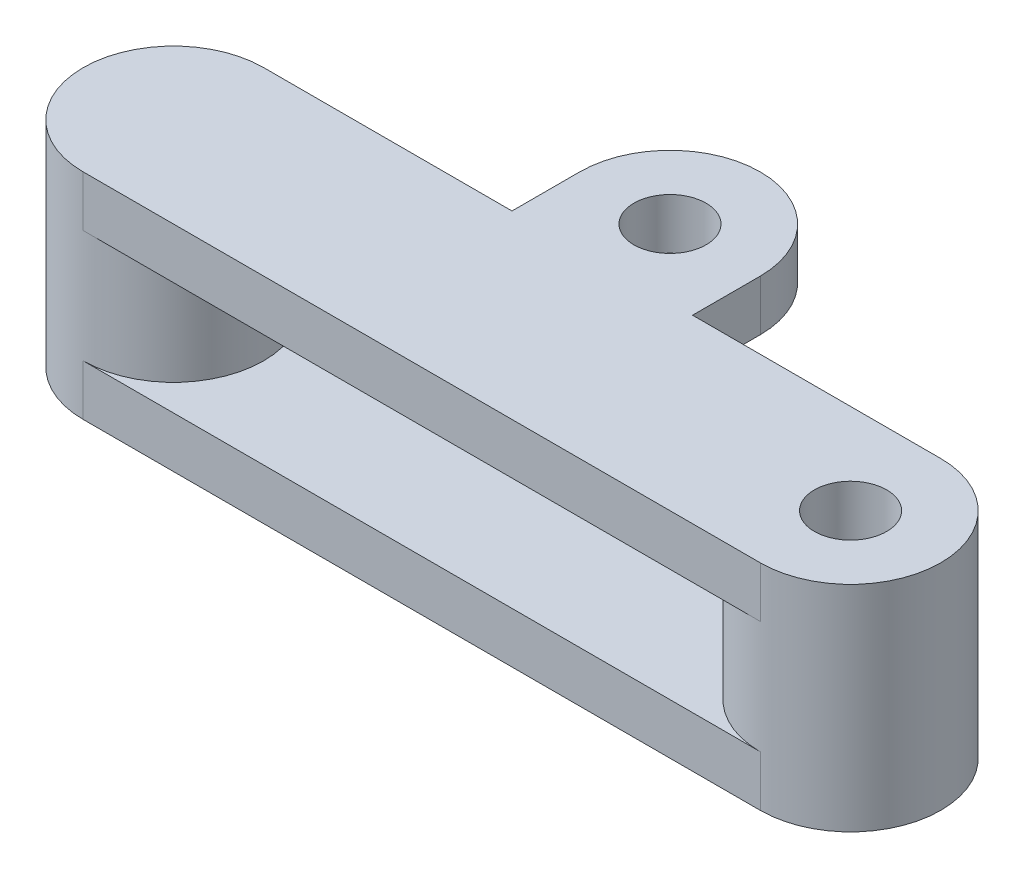
ISO-10303-21;
HEADER;
FILE_DESCRIPTION(('STEP AP214'),'2;1');
FILE_NAME('part.step','',(''),(''),'','','');
FILE_SCHEMA(('AUTOMOTIVE_DESIGN { 1 0 10303 214 1 1 1 1 }'));
ENDSEC;
DATA;
#1=APPLICATION_CONTEXT('core data for automotive mechanical design processes');
#2=APPLICATION_PROTOCOL_DEFINITION('international standard','automotive_design',2000,#1);
#3=PRODUCT_CONTEXT('',#1,'mechanical');
#4=PRODUCT('Part','Part','',(#3));
#5=PRODUCT_RELATED_PRODUCT_CATEGORY('part','',(#4));
#6=PRODUCT_DEFINITION_FORMATION('','',#4);
#7=PRODUCT_DEFINITION_CONTEXT('part definition',#1,'design');
#8=PRODUCT_DEFINITION('design','',#6,#7);
#9=PRODUCT_DEFINITION_SHAPE('','',#8);
#10=(LENGTH_UNIT() NAMED_UNIT(*) SI_UNIT(.MILLI.,.METRE.));
#11=(NAMED_UNIT(*) PLANE_ANGLE_UNIT() SI_UNIT($,.RADIAN.));
#12=(NAMED_UNIT(*) SI_UNIT($,.STERADIAN.) SOLID_ANGLE_UNIT());
#13=UNCERTAINTY_MEASURE_WITH_UNIT(LENGTH_MEASURE(1.E-05),#10,'distance_accuracy_value','');
#14=(GEOMETRIC_REPRESENTATION_CONTEXT(3) GLOBAL_UNCERTAINTY_ASSIGNED_CONTEXT((#13)) GLOBAL_UNIT_ASSIGNED_CONTEXT((#10,
#11,#12)) REPRESENTATION_CONTEXT('',''));
#15=CARTESIAN_POINT('',(0.,0.,0.));
#16=DIRECTION('',(0.,0.,1.));
#17=DIRECTION('',(1.,0.,0.));
#18=AXIS2_PLACEMENT_3D('',#15,#16,#17);
#19=CARTESIAN_POINT('',(0.,9.5,-4.));
#20=DIRECTION('',(0.,0.,1.));
#21=DIRECTION('',(1.,0.,0.));
#22=AXIS2_PLACEMENT_3D('',#19,#20,#21);
#23=PLANE('',#22);
#24=DIRECTION('',(-1.,0.,0.));
#25=VECTOR('',#24,1.);
#26=CARTESIAN_POINT('',(0.,2.25,-4.));
#27=LINE('',#26,#25);
#28=CARTESIAN_POINT('',(0.,2.25,-4.));
#29=VERTEX_POINT('',#28);
#30=CARTESIAN_POINT('',(-11.,2.25,-4.));
#31=VERTEX_POINT('',#30);
#32=EDGE_CURVE('E155',#29,#31,#27,.T.);
#33=ORIENTED_EDGE('',*,*,#32,.F.);
#34=DIRECTION('',(0.,-1.,0.));
#35=VECTOR('',#34,1.);
#36=CARTESIAN_POINT('',(0.,9.5,-4.));
#37=LINE('',#36,#35);
#38=CARTESIAN_POINT('',(0.,0.,-4.));
#39=VERTEX_POINT('',#38);
#40=EDGE_CURVE('E50',#29,#39,#37,.T.);
#41=ORIENTED_EDGE('',*,*,#40,.T.);
#42=DIRECTION('',(-1.,0.,0.));
#43=VECTOR('',#42,1.);
#44=CARTESIAN_POINT('',(0.,0.,-4.));
#45=LINE('',#44,#43);
#46=CARTESIAN_POINT('',(-11.,0.,-4.));
#47=VERTEX_POINT('',#46);
#48=EDGE_CURVE('E227',#39,#47,#45,.T.);
#49=ORIENTED_EDGE('',*,*,#48,.T.);
#50=DIRECTION('',(0.,-1.,0.));
#51=VECTOR('',#50,1.);
#52=CARTESIAN_POINT('',(-11.,9.5,-4.));
#53=LINE('',#52,#51);
#54=EDGE_CURVE('E166',#31,#47,#53,.T.);
#55=ORIENTED_EDGE('',*,*,#54,.F.);
#56=EDGE_LOOP('',(#33,#41,#49,#55));
#57=FACE_BOUND('',#56,.T.);
#58=ADVANCED_FACE('F41',(#57),#23,.F.);
#59=CARTESIAN_POINT('',(-11.,9.5,-7.));
#60=DIRECTION('',(-1.,0.,0.));
#61=DIRECTION('',(0.,0.,1.));
#62=AXIS2_PLACEMENT_3D('',#59,#60,#61);
#63=PLANE('',#62);
#64=DIRECTION('',(0.,0.,-1.));
#65=VECTOR('',#64,1.);
#66=CARTESIAN_POINT('',(-11.,2.25,-4.));
#67=LINE('',#66,#65);
#68=CARTESIAN_POINT('',(-11.,2.25,-7.));
#69=VERTEX_POINT('',#68);
#70=EDGE_CURVE('E167',#31,#69,#67,.T.);
#71=ORIENTED_EDGE('',*,*,#70,.F.);
#72=ORIENTED_EDGE('',*,*,#54,.T.);
#73=DIRECTION('',(0.,0.,-1.));
#74=VECTOR('',#73,1.);
#75=CARTESIAN_POINT('',(-11.,0.,-7.));
#76=LINE('',#75,#74);
#77=CARTESIAN_POINT('',(-11.,0.,-7.));
#78=VERTEX_POINT('',#77);
#79=EDGE_CURVE('E229',#47,#78,#76,.T.);
#80=ORIENTED_EDGE('',*,*,#79,.T.);
#81=DIRECTION('',(0.,-1.,0.));
#82=VECTOR('',#81,1.);
#83=CARTESIAN_POINT('',(-11.,9.5,-7.));
#84=LINE('',#83,#82);
#85=EDGE_CURVE('E262',#69,#78,#84,.T.);
#86=ORIENTED_EDGE('',*,*,#85,.F.);
#87=EDGE_LOOP('',(#71,#72,#80,#86));
#88=FACE_BOUND('',#87,.T.);
#89=ADVANCED_FACE('F279',(#88),#63,.F.);
#90=CARTESIAN_POINT('',(-15.,9.5,-7.));
#91=DIRECTION('',(0.,-1.,0.));
#92=DIRECTION('',(0.,0.,-1.));
#93=AXIS2_PLACEMENT_3D('',#90,#91,#92);
#94=CYLINDRICAL_SURFACE('',#93,4.);
#95=CARTESIAN_POINT('',(-15.,2.25,-7.));
#96=DIRECTION('',(0.,1.,0.));
#97=DIRECTION('',(0.,0.,1.));
#98=AXIS2_PLACEMENT_3D('',#95,#96,#97);
#99=CIRCLE('',#98,4.);
#100=CARTESIAN_POINT('',(-19.,2.25,-7.));
#101=VERTEX_POINT('',#100);
#102=EDGE_CURVE('E276',#69,#101,#99,.T.);
#103=ORIENTED_EDGE('',*,*,#102,.F.);
#104=ORIENTED_EDGE('',*,*,#85,.T.);
#105=CARTESIAN_POINT('',(-15.,0.,-7.));
#106=DIRECTION('',(0.,1.,0.));
#107=DIRECTION('',(0.,0.,1.));
#108=AXIS2_PLACEMENT_3D('',#105,#106,#107);
#109=CIRCLE('',#108,4.);
#110=CARTESIAN_POINT('',(-19.,0.,-7.));
#111=VERTEX_POINT('',#110);
#112=EDGE_CURVE('E232',#78,#111,#109,.T.);
#113=ORIENTED_EDGE('',*,*,#112,.T.);
#114=DIRECTION('',(0.,-1.,0.));
#115=VECTOR('',#114,1.);
#116=CARTESIAN_POINT('',(-19.,9.5,-7.));
#117=LINE('',#116,#115);
#118=EDGE_CURVE('E259',#101,#111,#117,.T.);
#119=ORIENTED_EDGE('',*,*,#118,.F.);
#120=EDGE_LOOP('',(#103,#104,#113,#119));
#121=FACE_BOUND('',#120,.T.);
#122=ADVANCED_FACE('F272',(#121),#94,.T.);
#123=CARTESIAN_POINT('',(-19.,9.5,-7.));
#124=DIRECTION('',(1.,0.,0.));
#125=DIRECTION('',(0.,0.,-1.));
#126=AXIS2_PLACEMENT_3D('',#123,#124,#125);
#127=PLANE('',#126);
#128=DIRECTION('',(0.,0.,1.));
#129=VECTOR('',#128,1.);
#130=CARTESIAN_POINT('',(-19.,2.25,-7.));
#131=LINE('',#130,#129);
#132=CARTESIAN_POINT('',(-19.,2.25,-4.));
#133=VERTEX_POINT('',#132);
#134=EDGE_CURVE('E289',#101,#133,#131,.T.);
#135=ORIENTED_EDGE('',*,*,#134,.F.);
#136=ORIENTED_EDGE('',*,*,#118,.T.);
#137=DIRECTION('',(0.,0.,1.));
#138=VECTOR('',#137,1.);
#139=CARTESIAN_POINT('',(-19.,0.,-7.));
#140=LINE('',#139,#138);
#141=CARTESIAN_POINT('',(-19.,0.,-4.));
#142=VERTEX_POINT('',#141);
#143=EDGE_CURVE('E235',#111,#142,#140,.T.);
#144=ORIENTED_EDGE('',*,*,#143,.T.);
#145=DIRECTION('',(0.,-1.,0.));
#146=VECTOR('',#145,1.);
#147=CARTESIAN_POINT('',(-19.,9.5,-4.));
#148=LINE('',#147,#146);
#149=EDGE_CURVE('E255',#133,#142,#148,.T.);
#150=ORIENTED_EDGE('',*,*,#149,.F.);
#151=EDGE_LOOP('',(#135,#136,#144,#150));
#152=FACE_BOUND('',#151,.T.);
#153=ADVANCED_FACE('F288',(#152),#127,.F.);
#154=CARTESIAN_POINT('',(-19.,9.5,-4.));
#155=DIRECTION('',(0.,0.,1.));
#156=DIRECTION('',(1.,0.,0.));
#157=AXIS2_PLACEMENT_3D('',#154,#155,#156);
#158=PLANE('',#157);
#159=DIRECTION('',(-1.,0.,0.));
#160=VECTOR('',#159,1.);
#161=CARTESIAN_POINT('',(-19.,2.25,-4.));
#162=LINE('',#161,#160);
#163=CARTESIAN_POINT('',(-30.,2.25,-4.));
#164=VERTEX_POINT('',#163);
#165=EDGE_CURVE('E58',#133,#164,#162,.T.);
#166=ORIENTED_EDGE('',*,*,#165,.F.);
#167=ORIENTED_EDGE('',*,*,#149,.T.);
#168=DIRECTION('',(-1.,0.,0.));
#169=VECTOR('',#168,1.);
#170=CARTESIAN_POINT('',(-19.,0.,-4.));
#171=LINE('',#170,#169);
#172=CARTESIAN_POINT('',(-30.,0.,-4.));
#173=VERTEX_POINT('',#172);
#174=EDGE_CURVE('E238',#142,#173,#171,.T.);
#175=ORIENTED_EDGE('',*,*,#174,.T.);
#176=DIRECTION('',(0.,-1.,0.));
#177=VECTOR('',#176,1.);
#178=CARTESIAN_POINT('',(-30.,9.5,-4.));
#179=LINE('',#178,#177);
#180=EDGE_CURVE('E251',#164,#173,#179,.T.);
#181=ORIENTED_EDGE('',*,*,#180,.F.);
#182=EDGE_LOOP('',(#166,#167,#175,#181));
#183=FACE_BOUND('',#182,.T.);
#184=ADVANCED_FACE('F374',(#183),#158,.F.);
#185=CARTESIAN_POINT('',(0.,9.5,4.));
#186=DIRECTION('',(0.,0.,-1.));
#187=DIRECTION('',(-1.,0.,0.));
#188=AXIS2_PLACEMENT_3D('',#185,#186,#187);
#189=PLANE('',#188);
#190=DIRECTION('',(1.,0.,0.));
#191=VECTOR('',#190,1.);
#192=CARTESIAN_POINT('',(-30.,2.25,4.));
#193=LINE('',#192,#191);
#194=CARTESIAN_POINT('',(-30.,2.25,4.));
#195=VERTEX_POINT('',#194);
#196=CARTESIAN_POINT('',(0.,2.25,4.));
#197=VERTEX_POINT('',#196);
#198=EDGE_CURVE('E157',#195,#197,#193,.T.);
#199=ORIENTED_EDGE('',*,*,#198,.F.);
#200=DIRECTION('',(0.,-1.,0.));
#201=VECTOR('',#200,1.);
#202=CARTESIAN_POINT('',(-30.,9.5,4.));
#203=LINE('',#202,#201);
#204=CARTESIAN_POINT('',(-30.,0.,4.));
#205=VERTEX_POINT('',#204);
#206=EDGE_CURVE('E248',#195,#205,#203,.T.);
#207=ORIENTED_EDGE('',*,*,#206,.T.);
#208=DIRECTION('',(1.,0.,0.));
#209=VECTOR('',#208,1.);
#210=CARTESIAN_POINT('',(0.,0.,4.));
#211=LINE('',#210,#209);
#212=CARTESIAN_POINT('',(0.,0.,4.));
#213=VERTEX_POINT('',#212);
#214=EDGE_CURVE('E211',#205,#213,#211,.T.);
#215=ORIENTED_EDGE('',*,*,#214,.T.);
#216=DIRECTION('',(0.,-1.,0.));
#217=VECTOR('',#216,1.);
#218=CARTESIAN_POINT('',(0.,9.5,4.));
#219=LINE('',#218,#217);
#220=EDGE_CURVE('E225',#197,#213,#219,.T.);
#221=ORIENTED_EDGE('',*,*,#220,.F.);
#222=EDGE_LOOP('',(#199,#207,#215,#221));
#223=FACE_BOUND('',#222,.T.);
#224=ADVANCED_FACE('F361',(#223),#189,.F.);
#225=CARTESIAN_POINT('',(-15.,9.5,-7.));
#226=DIRECTION('',(0.,-1.,0.));
#227=DIRECTION('',(0.,0.,-1.));
#228=AXIS2_PLACEMENT_3D('',#225,#226,#227);
#229=CYLINDRICAL_SURFACE('',#228,1.6);
#230=CARTESIAN_POINT('',(-15.,0.,-7.));
#231=DIRECTION('',(0.,1.,0.));
#232=DIRECTION('',(0.,0.,1.));
#233=AXIS2_PLACEMENT_3D('',#230,#231,#232);
#234=CIRCLE('',#233,1.6);
#235=CARTESIAN_POINT('',(-15.,0.,-5.4));
#236=VERTEX_POINT('',#235);
#237=EDGE_CURVE('E183',#236,#236,#234,.T.);
#238=ORIENTED_EDGE('',*,*,#237,.F.);
#239=EDGE_LOOP('',(#238));
#240=FACE_BOUND('',#239,.T.);
#241=CARTESIAN_POINT('',(-15.,2.25,-7.));
#242=DIRECTION('',(0.,1.,0.));
#243=DIRECTION('',(0.,0.,1.));
#244=AXIS2_PLACEMENT_3D('',#241,#242,#243);
#245=CIRCLE('',#244,1.6);
#246=CARTESIAN_POINT('',(-15.,2.25,-5.4));
#247=VERTEX_POINT('',#246);
#248=EDGE_CURVE('E177',#247,#247,#245,.T.);
#249=ORIENTED_EDGE('',*,*,#248,.T.);
#250=EDGE_LOOP('',(#249));
#251=FACE_BOUND('',#250,.T.);
#252=ADVANCED_FACE('F373',(#240,#251),#229,.F.);
#253=CARTESIAN_POINT('',(0.,9.5,0.));
#254=DIRECTION('',(0.,1.,0.));
#255=DIRECTION('',(0.,0.,1.));
#256=AXIS2_PLACEMENT_3D('',#253,#254,#255);
#257=PLANE('',#256);
#258=CARTESIAN_POINT('',(0.,9.5,0.));
#259=DIRECTION('',(0.,1.,0.));
#260=DIRECTION('',(0.,0.,1.));
#261=AXIS2_PLACEMENT_3D('',#258,#259,#260);
#262=CIRCLE('',#261,1.6);
#263=CARTESIAN_POINT('',(0.,9.5,1.6));
#264=VERTEX_POINT('',#263);
#265=EDGE_CURVE('E202',#264,#264,#262,.T.);
#266=ORIENTED_EDGE('',*,*,#265,.F.);
#267=EDGE_LOOP('',(#266));
#268=FACE_BOUND('',#267,.T.);
#269=CARTESIAN_POINT('',(0.,9.5,0.));
#270=DIRECTION('',(0.,1.,0.));
#271=DIRECTION('',(0.,0.,1.));
#272=AXIS2_PLACEMENT_3D('',#269,#270,#271);
#273=CIRCLE('',#272,4.);
#274=CARTESIAN_POINT('',(0.,9.5,4.));
#275=VERTEX_POINT('',#274);
#276=CARTESIAN_POINT('',(0.,9.5,-4.));
#277=VERTEX_POINT('',#276);
#278=EDGE_CURVE('E207',#275,#277,#273,.T.);
#279=ORIENTED_EDGE('',*,*,#278,.T.);
#280=DIRECTION('',(-1.,0.,0.));
#281=VECTOR('',#280,1.);
#282=CARTESIAN_POINT('',(0.,9.5,-4.));
#283=LINE('',#282,#281);
#284=CARTESIAN_POINT('',(-11.,9.5,-4.));
#285=VERTEX_POINT('',#284);
#286=EDGE_CURVE('E210',#277,#285,#283,.T.);
#287=ORIENTED_EDGE('',*,*,#286,.T.);
#288=DIRECTION('',(0.,0.,-1.));
#289=VECTOR('',#288,1.);
#290=CARTESIAN_POINT('',(-11.,9.5,-7.));
#291=LINE('',#290,#289);
#292=CARTESIAN_POINT('',(-11.,9.5,-7.));
#293=VERTEX_POINT('',#292);
#294=EDGE_CURVE('E213',#285,#293,#291,.T.);
#295=ORIENTED_EDGE('',*,*,#294,.T.);
#296=CARTESIAN_POINT('',(-15.,9.5,-7.));
#297=DIRECTION('',(0.,1.,0.));
#298=DIRECTION('',(0.,0.,1.));
#299=AXIS2_PLACEMENT_3D('',#296,#297,#298);
#300=CIRCLE('',#299,4.);
#301=CARTESIAN_POINT('',(-19.,9.5,-7.));
#302=VERTEX_POINT('',#301);
#303=EDGE_CURVE('E215',#293,#302,#300,.T.);
#304=ORIENTED_EDGE('',*,*,#303,.T.);
#305=DIRECTION('',(0.,0.,1.));
#306=VECTOR('',#305,1.);
#307=CARTESIAN_POINT('',(-19.,9.5,-7.));
#308=LINE('',#307,#306);
#309=CARTESIAN_POINT('',(-19.,9.5,-4.));
#310=VERTEX_POINT('',#309);
#311=EDGE_CURVE('E217',#302,#310,#308,.T.);
#312=ORIENTED_EDGE('',*,*,#311,.T.);
#313=DIRECTION('',(-1.,0.,0.));
#314=VECTOR('',#313,1.);
#315=CARTESIAN_POINT('',(-19.,9.5,-4.));
#316=LINE('',#315,#314);
#317=CARTESIAN_POINT('',(-30.,9.5,-4.));
#318=VERTEX_POINT('',#317);
#319=EDGE_CURVE('E219',#310,#318,#316,.T.);
#320=ORIENTED_EDGE('',*,*,#319,.T.);
#321=CARTESIAN_POINT('',(-30.,9.5,0.));
#322=DIRECTION('',(0.,1.,0.));
#323=DIRECTION('',(0.,0.,1.));
#324=AXIS2_PLACEMENT_3D('',#321,#322,#323);
#325=CIRCLE('',#324,4.);
#326=CARTESIAN_POINT('',(-30.,9.5,4.));
#327=VERTEX_POINT('',#326);
#328=EDGE_CURVE('E221',#318,#327,#325,.T.);
#329=ORIENTED_EDGE('',*,*,#328,.T.);
#330=DIRECTION('',(1.,0.,0.));
#331=VECTOR('',#330,1.);
#332=CARTESIAN_POINT('',(0.,9.5,4.));
#333=LINE('',#332,#331);
#334=EDGE_CURVE('E223',#327,#275,#333,.T.);
#335=ORIENTED_EDGE('',*,*,#334,.T.);
#336=EDGE_LOOP('',(#279,#287,#295,#304,#312,#320,#329,#335));
#337=FACE_BOUND('',#336,.T.);
#338=CARTESIAN_POINT('',(-15.,9.5,-7.));
#339=DIRECTION('',(0.,1.,0.));
#340=DIRECTION('',(0.,0.,1.));
#341=AXIS2_PLACEMENT_3D('',#338,#339,#340);
#342=CIRCLE('',#341,1.6);
#343=CARTESIAN_POINT('',(-15.,9.5,-5.4));
#344=VERTEX_POINT('',#343);
#345=EDGE_CURVE('E196',#344,#344,#342,.T.);
#346=ORIENTED_EDGE('',*,*,#345,.F.);
#347=EDGE_LOOP('',(#346));
#348=FACE_BOUND('',#347,.T.);
#349=ADVANCED_FACE('F323',(#268,#337,#348),#257,.T.);
#350=CARTESIAN_POINT('',(0.,0.,0.));
#351=DIRECTION('',(0.,1.,0.));
#352=DIRECTION('',(0.,0.,1.));
#353=AXIS2_PLACEMENT_3D('',#350,#351,#352);
#354=PLANE('',#353);
#355=CARTESIAN_POINT('',(0.,0.,0.));
#356=DIRECTION('',(0.,1.,0.));
#357=DIRECTION('',(0.,0.,1.));
#358=AXIS2_PLACEMENT_3D('',#355,#356,#357);
#359=CIRCLE('',#358,4.);
#360=EDGE_CURVE('E172',#213,#39,#359,.T.);
#361=ORIENTED_EDGE('',*,*,#360,.F.);
#362=ORIENTED_EDGE('',*,*,#214,.F.);
#363=CARTESIAN_POINT('',(-30.,0.,0.));
#364=DIRECTION('',(0.,1.,0.));
#365=DIRECTION('',(0.,0.,1.));
#366=AXIS2_PLACEMENT_3D('',#363,#364,#365);
#367=CIRCLE('',#366,4.);
#368=EDGE_CURVE('E241',#173,#205,#367,.T.);
#369=ORIENTED_EDGE('',*,*,#368,.F.);
#370=ORIENTED_EDGE('',*,*,#174,.F.);
#371=ORIENTED_EDGE('',*,*,#143,.F.);
#372=ORIENTED_EDGE('',*,*,#112,.F.);
#373=ORIENTED_EDGE('',*,*,#79,.F.);
#374=ORIENTED_EDGE('',*,*,#48,.F.);
#375=EDGE_LOOP('',(#361,#362,#369,#370,#371,#372,#373,#374));
#376=FACE_BOUND('',#375,.T.);
#377=CARTESIAN_POINT('',(0.,0.,0.));
#378=DIRECTION('',(0.,1.,0.));
#379=DIRECTION('',(0.,0.,1.));
#380=AXIS2_PLACEMENT_3D('',#377,#378,#379);
#381=CIRCLE('',#380,1.6);
#382=CARTESIAN_POINT('',(0.,0.,1.6));
#383=VERTEX_POINT('',#382);
#384=EDGE_CURVE('E199',#383,#383,#381,.T.);
#385=ORIENTED_EDGE('',*,*,#384,.T.);
#386=EDGE_LOOP('',(#385));
#387=FACE_BOUND('',#386,.T.);
#388=ORIENTED_EDGE('',*,*,#237,.T.);
#389=EDGE_LOOP('',(#388));
#390=FACE_BOUND('',#389,.T.);
#391=ADVANCED_FACE('F281',(#376,#387,#390),#354,.F.);
#392=CARTESIAN_POINT('',(0.,9.5,0.));
#393=DIRECTION('',(0.,-1.,0.));
#394=DIRECTION('',(0.,0.,-1.));
#395=AXIS2_PLACEMENT_3D('',#392,#393,#394);
#396=CYLINDRICAL_SURFACE('',#395,4.);
#397=ORIENTED_EDGE('',*,*,#40,.F.);
#398=CARTESIAN_POINT('',(0.,2.25,0.));
#399=DIRECTION('',(0.,-1.,0.));
#400=DIRECTION('',(0.,0.,1.));
#401=AXIS2_PLACEMENT_3D('',#398,#399,#400);
#402=CIRCLE('',#401,4.);
#403=EDGE_CURVE('E152',#197,#29,#402,.T.);
#404=ORIENTED_EDGE('',*,*,#403,.F.);
#405=ORIENTED_EDGE('',*,*,#220,.T.);
#406=ORIENTED_EDGE('',*,*,#360,.T.);
#407=EDGE_LOOP('',(#397,#404,#405,#406));
#408=FACE_BOUND('',#407,.T.);
#409=CARTESIAN_POINT('',(0.,7.25,0.));
#410=DIRECTION('',(0.,-1.,0.));
#411=DIRECTION('',(0.,0.,1.));
#412=AXIS2_PLACEMENT_3D('',#409,#410,#411);
#413=CIRCLE('',#412,4.);
#414=CARTESIAN_POINT('',(0.,7.25,4.));
#415=VERTEX_POINT('',#414);
#416=CARTESIAN_POINT('',(0.,7.25,-4.));
#417=VERTEX_POINT('',#416);
#418=EDGE_CURVE('E297',#415,#417,#413,.T.);
#419=ORIENTED_EDGE('',*,*,#418,.T.);
#420=EDGE_CURVE('E11',#277,#417,#37,.T.);
#421=ORIENTED_EDGE('',*,*,#420,.F.);
#422=ORIENTED_EDGE('',*,*,#278,.F.);
#423=EDGE_CURVE('E246',#275,#415,#219,.T.);
#424=ORIENTED_EDGE('',*,*,#423,.T.);
#425=EDGE_LOOP('',(#419,#421,#422,#424));
#426=FACE_BOUND('',#425,.T.);
#427=ADVANCED_FACE('F43',(#408,#426),#396,.T.);
#428=ORIENTED_EDGE('',*,*,#420,.T.);
#429=DIRECTION('',(-1.,0.,0.));
#430=VECTOR('',#429,1.);
#431=CARTESIAN_POINT('',(0.,7.25,-4.));
#432=LINE('',#431,#430);
#433=CARTESIAN_POINT('',(-11.,7.25,-4.));
#434=VERTEX_POINT('',#433);
#435=EDGE_CURVE('E300',#417,#434,#432,.T.);
#436=ORIENTED_EDGE('',*,*,#435,.T.);
#437=EDGE_CURVE('E173',#285,#434,#53,.T.);
#438=ORIENTED_EDGE('',*,*,#437,.F.);
#439=ORIENTED_EDGE('',*,*,#286,.F.);
#440=EDGE_LOOP('',(#428,#436,#438,#439));
#441=FACE_BOUND('',#440,.T.);
#442=ADVANCED_FACE('F339',(#441),#23,.F.);
#443=ORIENTED_EDGE('',*,*,#437,.T.);
#444=DIRECTION('',(0.,0.,-1.));
#445=VECTOR('',#444,1.);
#446=CARTESIAN_POINT('',(-11.,7.25,-4.));
#447=LINE('',#446,#445);
#448=CARTESIAN_POINT('',(-11.,7.25,-7.));
#449=VERTEX_POINT('',#448);
#450=EDGE_CURVE('E303',#434,#449,#447,.T.);
#451=ORIENTED_EDGE('',*,*,#450,.T.);
#452=EDGE_CURVE('E263',#293,#449,#84,.T.);
#453=ORIENTED_EDGE('',*,*,#452,.F.);
#454=ORIENTED_EDGE('',*,*,#294,.F.);
#455=EDGE_LOOP('',(#443,#451,#453,#454));
#456=FACE_BOUND('',#455,.T.);
#457=ADVANCED_FACE('F332',(#456),#63,.F.);
#458=ORIENTED_EDGE('',*,*,#452,.T.);
#459=CARTESIAN_POINT('',(-15.,7.25,-7.));
#460=DIRECTION('',(0.,1.,0.));
#461=DIRECTION('',(0.,0.,1.));
#462=AXIS2_PLACEMENT_3D('',#459,#460,#461);
#463=CIRCLE('',#462,4.);
#464=CARTESIAN_POINT('',(-19.,7.25,-7.));
#465=VERTEX_POINT('',#464);
#466=EDGE_CURVE('E306',#449,#465,#463,.T.);
#467=ORIENTED_EDGE('',*,*,#466,.T.);
#468=EDGE_CURVE('E260',#302,#465,#117,.T.);
#469=ORIENTED_EDGE('',*,*,#468,.F.);
#470=ORIENTED_EDGE('',*,*,#303,.F.);
#471=EDGE_LOOP('',(#458,#467,#469,#470));
#472=FACE_BOUND('',#471,.T.);
#473=ADVANCED_FACE('F330',(#472),#94,.T.);
#474=ORIENTED_EDGE('',*,*,#468,.T.);
#475=DIRECTION('',(0.,0.,1.));
#476=VECTOR('',#475,1.);
#477=CARTESIAN_POINT('',(-19.,7.25,-7.));
#478=LINE('',#477,#476);
#479=CARTESIAN_POINT('',(-19.,7.25,-4.));
#480=VERTEX_POINT('',#479);
#481=EDGE_CURVE('E308',#465,#480,#478,.T.);
#482=ORIENTED_EDGE('',*,*,#481,.T.);
#483=EDGE_CURVE('E256',#310,#480,#148,.T.);
#484=ORIENTED_EDGE('',*,*,#483,.F.);
#485=ORIENTED_EDGE('',*,*,#311,.F.);
#486=EDGE_LOOP('',(#474,#482,#484,#485));
#487=FACE_BOUND('',#486,.T.);
#488=ADVANCED_FACE('F328',(#487),#127,.F.);
#489=ORIENTED_EDGE('',*,*,#483,.T.);
#490=DIRECTION('',(-1.,0.,0.));
#491=VECTOR('',#490,1.);
#492=CARTESIAN_POINT('',(-19.,7.25,-4.));
#493=LINE('',#492,#491);
#494=CARTESIAN_POINT('',(-30.,7.25,-4.));
#495=VERTEX_POINT('',#494);
#496=EDGE_CURVE('E192',#480,#495,#493,.T.);
#497=ORIENTED_EDGE('',*,*,#496,.T.);
#498=EDGE_CURVE('E252',#318,#495,#179,.T.);
#499=ORIENTED_EDGE('',*,*,#498,.F.);
#500=ORIENTED_EDGE('',*,*,#319,.F.);
#501=EDGE_LOOP('',(#489,#497,#499,#500));
#502=FACE_BOUND('',#501,.T.);
#503=ADVANCED_FACE('F313',(#502),#158,.F.);
#504=CARTESIAN_POINT('',(-30.,9.5,0.));
#505=DIRECTION('',(0.,-1.,0.));
#506=DIRECTION('',(0.,0.,-1.));
#507=AXIS2_PLACEMENT_3D('',#504,#505,#506);
#508=CYLINDRICAL_SURFACE('',#507,4.);
#509=CARTESIAN_POINT('',(-30.,2.25,0.));
#510=DIRECTION('',(0.,-1.,0.));
#511=DIRECTION('',(0.,0.,1.));
#512=AXIS2_PLACEMENT_3D('',#509,#510,#511);
#513=CIRCLE('',#512,4.);
#514=EDGE_CURVE('E62',#164,#195,#513,.T.);
#515=ORIENTED_EDGE('',*,*,#514,.F.);
#516=ORIENTED_EDGE('',*,*,#180,.T.);
#517=ORIENTED_EDGE('',*,*,#368,.T.);
#518=ORIENTED_EDGE('',*,*,#206,.F.);
#519=EDGE_LOOP('',(#515,#516,#517,#518));
#520=FACE_BOUND('',#519,.T.);
#521=ORIENTED_EDGE('',*,*,#498,.T.);
#522=CARTESIAN_POINT('',(-30.,7.25,0.));
#523=DIRECTION('',(0.,-1.,0.));
#524=DIRECTION('',(0.,0.,1.));
#525=AXIS2_PLACEMENT_3D('',#522,#523,#524);
#526=CIRCLE('',#525,4.);
#527=CARTESIAN_POINT('',(-30.,7.25,4.));
#528=VERTEX_POINT('',#527);
#529=EDGE_CURVE('E185',#495,#528,#526,.T.);
#530=ORIENTED_EDGE('',*,*,#529,.T.);
#531=EDGE_CURVE('E249',#327,#528,#203,.T.);
#532=ORIENTED_EDGE('',*,*,#531,.F.);
#533=ORIENTED_EDGE('',*,*,#328,.F.);
#534=EDGE_LOOP('',(#521,#530,#532,#533));
#535=FACE_BOUND('',#534,.T.);
#536=ADVANCED_FACE('F319',(#520,#535),#508,.T.);
#537=ORIENTED_EDGE('',*,*,#531,.T.);
#538=DIRECTION('',(1.,0.,0.));
#539=VECTOR('',#538,1.);
#540=CARTESIAN_POINT('',(-30.,7.25,4.));
#541=LINE('',#540,#539);
#542=EDGE_CURVE('E179',#528,#415,#541,.T.);
#543=ORIENTED_EDGE('',*,*,#542,.T.);
#544=ORIENTED_EDGE('',*,*,#423,.F.);
#545=ORIENTED_EDGE('',*,*,#334,.F.);
#546=EDGE_LOOP('',(#537,#543,#544,#545));
#547=FACE_BOUND('',#546,.T.);
#548=ADVANCED_FACE('F357',(#547),#189,.F.);
#549=CARTESIAN_POINT('',(0.,9.5,0.));
#550=DIRECTION('',(0.,-1.,0.));
#551=DIRECTION('',(0.,0.,-1.));
#552=AXIS2_PLACEMENT_3D('',#549,#550,#551);
#553=CYLINDRICAL_SURFACE('',#552,1.6);
#554=ORIENTED_EDGE('',*,*,#265,.T.);
#555=EDGE_LOOP('',(#554));
#556=FACE_BOUND('',#555,.T.);
#557=ORIENTED_EDGE('',*,*,#384,.F.);
#558=EDGE_LOOP('',(#557));
#559=FACE_BOUND('',#558,.T.);
#560=ADVANCED_FACE('F359',(#556,#559),#553,.F.);
#561=CARTESIAN_POINT('',(-15.,7.25,-7.));
#562=DIRECTION('',(0.,1.,0.));
#563=DIRECTION('',(0.,0.,1.));
#564=AXIS2_PLACEMENT_3D('',#561,#562,#563);
#565=CIRCLE('',#564,1.6);
#566=CARTESIAN_POINT('',(-15.,7.25,-5.4));
#567=VERTEX_POINT('',#566);
#568=EDGE_CURVE('E45',#567,#567,#565,.T.);
#569=ORIENTED_EDGE('',*,*,#568,.F.);
#570=EDGE_LOOP('',(#569));
#571=FACE_BOUND('',#570,.T.);
#572=ORIENTED_EDGE('',*,*,#345,.T.);
#573=EDGE_LOOP('',(#572));
#574=FACE_BOUND('',#573,.T.);
#575=ADVANCED_FACE('F366',(#571,#574),#229,.F.);
#576=CARTESIAN_POINT('',(0.,7.25,0.));
#577=DIRECTION('',(0.,1.,0.));
#578=DIRECTION('',(0.,0.,1.));
#579=AXIS2_PLACEMENT_3D('',#576,#577,#578);
#580=PLANE('',#579);
#581=ORIENTED_EDGE('',*,*,#568,.T.);
#582=EDGE_LOOP('',(#581));
#583=FACE_BOUND('',#582,.T.);
#584=ORIENTED_EDGE('',*,*,#418,.F.);
#585=ORIENTED_EDGE('',*,*,#542,.F.);
#586=ORIENTED_EDGE('',*,*,#529,.F.);
#587=ORIENTED_EDGE('',*,*,#496,.F.);
#588=ORIENTED_EDGE('',*,*,#481,.F.);
#589=ORIENTED_EDGE('',*,*,#466,.F.);
#590=ORIENTED_EDGE('',*,*,#450,.F.);
#591=ORIENTED_EDGE('',*,*,#435,.F.);
#592=EDGE_LOOP('',(#584,#585,#586,#587,#588,#589,#590,#591));
#593=FACE_BOUND('',#592,.T.);
#594=ADVANCED_FACE('F329',(#583,#593),#580,.F.);
#595=CARTESIAN_POINT('',(0.,2.25,0.));
#596=DIRECTION('',(0.,1.,0.));
#597=DIRECTION('',(0.,0.,1.));
#598=AXIS2_PLACEMENT_3D('',#595,#596,#597);
#599=PLANE('',#598);
#600=ORIENTED_EDGE('',*,*,#248,.F.);
#601=EDGE_LOOP('',(#600));
#602=FACE_BOUND('',#601,.T.);
#603=ORIENTED_EDGE('',*,*,#403,.T.);
#604=ORIENTED_EDGE('',*,*,#32,.T.);
#605=ORIENTED_EDGE('',*,*,#70,.T.);
#606=ORIENTED_EDGE('',*,*,#102,.T.);
#607=ORIENTED_EDGE('',*,*,#134,.T.);
#608=ORIENTED_EDGE('',*,*,#165,.T.);
#609=ORIENTED_EDGE('',*,*,#514,.T.);
#610=ORIENTED_EDGE('',*,*,#198,.T.);
#611=EDGE_LOOP('',(#603,#604,#605,#606,#607,#608,#609,#610));
#612=FACE_BOUND('',#611,.T.);
#613=ADVANCED_FACE('F154',(#602,#612),#599,.T.);
#614=CLOSED_SHELL('',(#58,#89,#122,#153,#184,#224,#252,#349,#391,#427,#442,#457,#473,#488,#503,
#536,#548,#560,#575,#594,#613));
#615=MANIFOLD_SOLID_BREP('B2',#614);
#616=ADVANCED_BREP_SHAPE_REPRESENTATION('',(#18,#615),#14);
#617=SHAPE_DEFINITION_REPRESENTATION(#9,#616);
ENDSEC;
END-ISO-10303-21;
